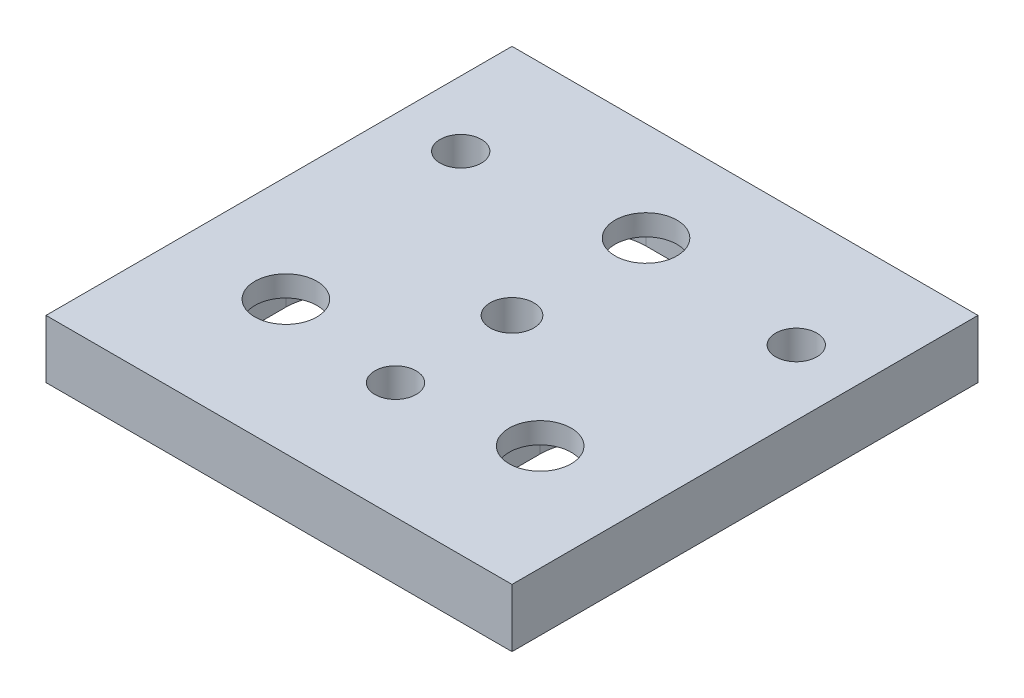
ISO-10303-21;
HEADER;
FILE_DESCRIPTION(('STEP AP214'),'2;1');
FILE_NAME('part.step','',(''),(''),'','','');
FILE_SCHEMA(('AUTOMOTIVE_DESIGN { 1 0 10303 214 1 1 1 1 }'));
ENDSEC;
DATA;
#1=APPLICATION_CONTEXT('core data for automotive mechanical design processes');
#2=APPLICATION_PROTOCOL_DEFINITION('international standard','automotive_design',2000,#1);
#3=PRODUCT_CONTEXT('',#1,'mechanical');
#4=PRODUCT('Part','Part','',(#3));
#5=PRODUCT_RELATED_PRODUCT_CATEGORY('part','',(#4));
#6=PRODUCT_DEFINITION_FORMATION('','',#4);
#7=PRODUCT_DEFINITION_CONTEXT('part definition',#1,'design');
#8=PRODUCT_DEFINITION('design','',#6,#7);
#9=PRODUCT_DEFINITION_SHAPE('','',#8);
#10=(LENGTH_UNIT() NAMED_UNIT(*) SI_UNIT(.MILLI.,.METRE.));
#11=(NAMED_UNIT(*) PLANE_ANGLE_UNIT() SI_UNIT($,.RADIAN.));
#12=(NAMED_UNIT(*) SI_UNIT($,.STERADIAN.) SOLID_ANGLE_UNIT());
#13=UNCERTAINTY_MEASURE_WITH_UNIT(LENGTH_MEASURE(1.E-05),#10,'distance_accuracy_value','');
#14=(GEOMETRIC_REPRESENTATION_CONTEXT(3) GLOBAL_UNCERTAINTY_ASSIGNED_CONTEXT((#13)) GLOBAL_UNIT_ASSIGNED_CONTEXT((#10,
#11,#12)) REPRESENTATION_CONTEXT('',''));
#15=CARTESIAN_POINT('',(0.,0.,0.));
#16=DIRECTION('',(0.,0.,1.));
#17=DIRECTION('',(1.,0.,0.));
#18=AXIS2_PLACEMENT_3D('',#15,#16,#17);
#19=CARTESIAN_POINT('',(0.,6.35,-14.61008));
#20=DIRECTION('',(0.,1.,0.));
#21=DIRECTION('',(0.,0.,1.));
#22=AXIS2_PLACEMENT_3D('',#19,#20,#21);
#23=CYLINDRICAL_SURFACE('',#22,3.3782);
#24=CARTESIAN_POINT('',(0.,6.35,-14.61008));
#25=DIRECTION('',(0.,1.,0.));
#26=DIRECTION('',(0.,0.,1.));
#27=AXIS2_PLACEMENT_3D('',#24,#25,#26);
#28=CIRCLE('',#27,3.3782);
#29=CARTESIAN_POINT('',(0.,6.35,-11.23188));
#30=VERTEX_POINT('',#29);
#31=EDGE_CURVE('E256',#30,#30,#28,.T.);
#32=ORIENTED_EDGE('',*,*,#31,.T.);
#33=EDGE_LOOP('',(#32));
#34=FACE_BOUND('',#33,.T.);
#35=CARTESIAN_POINT('',(0.,4.064,-14.61008));
#36=DIRECTION('',(0.,-1.,0.));
#37=DIRECTION('',(0.,0.,-1.));
#38=AXIS2_PLACEMENT_3D('',#35,#36,#37);
#39=CIRCLE('',#38,3.3782);
#40=CARTESIAN_POINT('',(0.,4.064,-17.98828));
#41=VERTEX_POINT('',#40);
#42=EDGE_CURVE('E38',#41,#41,#39,.F.);
#43=ORIENTED_EDGE('',*,*,#42,.F.);
#44=EDGE_LOOP('',(#43));
#45=FACE_BOUND('',#44,.T.);
#46=ADVANCED_FACE('F34',(#34,#45),#23,.F.);
#47=CARTESIAN_POINT('',(-25.4,6.35,-25.4));
#48=DIRECTION('',(1.,0.,0.));
#49=DIRECTION('',(0.,0.,-1.));
#50=AXIS2_PLACEMENT_3D('',#47,#48,#49);
#51=PLANE('',#50);
#52=DIRECTION('',(0.,0.,1.));
#53=VECTOR('',#52,1.);
#54=CARTESIAN_POINT('',(-25.4,0.,-25.4));
#55=LINE('',#54,#53);
#56=CARTESIAN_POINT('',(-25.4,0.,-25.4));
#57=VERTEX_POINT('',#56);
#58=CARTESIAN_POINT('',(-25.4,0.,25.4));
#59=VERTEX_POINT('',#58);
#60=EDGE_CURVE('E283',#57,#59,#55,.T.);
#61=ORIENTED_EDGE('',*,*,#60,.T.);
#62=DIRECTION('',(0.,-1.,0.));
#63=VECTOR('',#62,1.);
#64=CARTESIAN_POINT('',(-25.4,6.35,25.4));
#65=LINE('',#64,#63);
#66=CARTESIAN_POINT('',(-25.4,6.35,25.4));
#67=VERTEX_POINT('',#66);
#68=EDGE_CURVE('E11',#67,#59,#65,.T.);
#69=ORIENTED_EDGE('',*,*,#68,.F.);
#70=DIRECTION('',(0.,0.,1.));
#71=VECTOR('',#70,1.);
#72=CARTESIAN_POINT('',(-25.4,6.35,-25.4));
#73=LINE('',#72,#71);
#74=CARTESIAN_POINT('',(-25.4,6.35,-25.4));
#75=VERTEX_POINT('',#74);
#76=EDGE_CURVE('E284',#75,#67,#73,.T.);
#77=ORIENTED_EDGE('',*,*,#76,.F.);
#78=DIRECTION('',(0.,-1.,0.));
#79=VECTOR('',#78,1.);
#80=CARTESIAN_POINT('',(-25.4,6.35,-25.4));
#81=LINE('',#80,#79);
#82=EDGE_CURVE('E294',#75,#57,#81,.T.);
#83=ORIENTED_EDGE('',*,*,#82,.T.);
#84=EDGE_LOOP('',(#61,#69,#77,#83));
#85=FACE_BOUND('',#84,.T.);
#86=ADVANCED_FACE('F36',(#85),#51,.F.);
#87=CARTESIAN_POINT('',(-25.4,6.35,25.4));
#88=DIRECTION('',(0.,0.,-1.));
#89=DIRECTION('',(-1.,0.,0.));
#90=AXIS2_PLACEMENT_3D('',#87,#88,#89);
#91=PLANE('',#90);
#92=DIRECTION('',(1.,0.,0.));
#93=VECTOR('',#92,1.);
#94=CARTESIAN_POINT('',(-25.4,0.,25.4));
#95=LINE('',#94,#93);
#96=CARTESIAN_POINT('',(25.4,0.,25.4));
#97=VERTEX_POINT('',#96);
#98=EDGE_CURVE('E297',#59,#97,#95,.T.);
#99=ORIENTED_EDGE('',*,*,#98,.T.);
#100=DIRECTION('',(0.,-1.,0.));
#101=VECTOR('',#100,1.);
#102=CARTESIAN_POINT('',(25.4,6.35,25.4));
#103=LINE('',#102,#101);
#104=CARTESIAN_POINT('',(25.4,6.35,25.4));
#105=VERTEX_POINT('',#104);
#106=EDGE_CURVE('E43',#105,#97,#103,.T.);
#107=ORIENTED_EDGE('',*,*,#106,.F.);
#108=DIRECTION('',(1.,0.,0.));
#109=VECTOR('',#108,1.);
#110=CARTESIAN_POINT('',(-25.4,6.35,25.4));
#111=LINE('',#110,#109);
#112=EDGE_CURVE('E287',#67,#105,#111,.T.);
#113=ORIENTED_EDGE('',*,*,#112,.F.);
#114=ORIENTED_EDGE('',*,*,#68,.T.);
#115=EDGE_LOOP('',(#99,#107,#113,#114));
#116=FACE_BOUND('',#115,.T.);
#117=ADVANCED_FACE('F339',(#116),#91,.F.);
#118=CARTESIAN_POINT('',(25.4,6.35,-25.4));
#119=DIRECTION('',(-1.,0.,0.));
#120=DIRECTION('',(0.,0.,1.));
#121=AXIS2_PLACEMENT_3D('',#118,#119,#120);
#122=PLANE('',#121);
#123=DIRECTION('',(0.,0.,-1.));
#124=VECTOR('',#123,1.);
#125=CARTESIAN_POINT('',(25.4,0.,-25.4));
#126=LINE('',#125,#124);
#127=CARTESIAN_POINT('',(25.4,0.,-25.4));
#128=VERTEX_POINT('',#127);
#129=EDGE_CURVE('E299',#97,#128,#126,.T.);
#130=ORIENTED_EDGE('',*,*,#129,.T.);
#131=DIRECTION('',(0.,-1.,0.));
#132=VECTOR('',#131,1.);
#133=CARTESIAN_POINT('',(25.4,6.35,-25.4));
#134=LINE('',#133,#132);
#135=CARTESIAN_POINT('',(25.4,6.35,-25.4));
#136=VERTEX_POINT('',#135);
#137=EDGE_CURVE('E304',#136,#128,#134,.T.);
#138=ORIENTED_EDGE('',*,*,#137,.F.);
#139=DIRECTION('',(0.,0.,-1.));
#140=VECTOR('',#139,1.);
#141=CARTESIAN_POINT('',(25.4,6.35,-25.4));
#142=LINE('',#141,#140);
#143=EDGE_CURVE('E290',#105,#136,#142,.T.);
#144=ORIENTED_EDGE('',*,*,#143,.F.);
#145=ORIENTED_EDGE('',*,*,#106,.T.);
#146=EDGE_LOOP('',(#130,#138,#144,#145));
#147=FACE_BOUND('',#146,.T.);
#148=ADVANCED_FACE('F375',(#147),#122,.F.);
#149=CARTESIAN_POINT('',(-25.4,6.35,-25.4));
#150=DIRECTION('',(0.,0.,1.));
#151=DIRECTION('',(1.,0.,0.));
#152=AXIS2_PLACEMENT_3D('',#149,#150,#151);
#153=PLANE('',#152);
#154=DIRECTION('',(-1.,0.,0.));
#155=VECTOR('',#154,1.);
#156=CARTESIAN_POINT('',(-25.4,0.,-25.4));
#157=LINE('',#156,#155);
#158=EDGE_CURVE('E288',#128,#57,#157,.T.);
#159=ORIENTED_EDGE('',*,*,#158,.T.);
#160=ORIENTED_EDGE('',*,*,#82,.F.);
#161=DIRECTION('',(-1.,0.,0.));
#162=VECTOR('',#161,1.);
#163=CARTESIAN_POINT('',(-25.4,6.35,-25.4));
#164=LINE('',#163,#162);
#165=EDGE_CURVE('E292',#136,#75,#164,.T.);
#166=ORIENTED_EDGE('',*,*,#165,.F.);
#167=ORIENTED_EDGE('',*,*,#137,.T.);
#168=EDGE_LOOP('',(#159,#160,#166,#167));
#169=FACE_BOUND('',#168,.T.);
#170=ADVANCED_FACE('F368',(#169),#153,.F.);
#171=CARTESIAN_POINT('',(0.,6.35,0.));
#172=DIRECTION('',(0.,1.,0.));
#173=DIRECTION('',(0.,0.,1.));
#174=AXIS2_PLACEMENT_3D('',#171,#172,#173);
#175=PLANE('',#174);
#176=CARTESIAN_POINT('',(0.,6.35,0.));
#177=DIRECTION('',(0.,1.,0.));
#178=DIRECTION('',(0.,0.,1.));
#179=AXIS2_PLACEMENT_3D('',#176,#177,#178);
#180=CIRCLE('',#179,2.38125);
#181=CARTESIAN_POINT('',(0.,6.35,2.38125));
#182=VERTEX_POINT('',#181);
#183=EDGE_CURVE('E176',#182,#182,#180,.T.);
#184=ORIENTED_EDGE('',*,*,#183,.F.);
#185=EDGE_LOOP('',(#184));
#186=FACE_BOUND('',#185,.T.);
#187=ORIENTED_EDGE('',*,*,#31,.F.);
#188=EDGE_LOOP('',(#187));
#189=FACE_BOUND('',#188,.T.);
#190=CARTESIAN_POINT('',(-13.86078,6.35,10.78992));
#191=DIRECTION('',(0.,1.,0.));
#192=DIRECTION('',(0.,0.,1.));
#193=AXIS2_PLACEMENT_3D('',#190,#191,#192);
#194=CIRCLE('',#193,3.3782);
#195=CARTESIAN_POINT('',(-13.86078,6.35,14.16812));
#196=VERTEX_POINT('',#195);
#197=EDGE_CURVE('E259',#196,#196,#194,.T.);
#198=ORIENTED_EDGE('',*,*,#197,.F.);
#199=EDGE_LOOP('',(#198));
#200=FACE_BOUND('',#199,.T.);
#201=CARTESIAN_POINT('',(13.86078,6.35,10.78992));
#202=DIRECTION('',(0.,1.,0.));
#203=DIRECTION('',(0.,0.,1.));
#204=AXIS2_PLACEMENT_3D('',#201,#202,#203);
#205=CIRCLE('',#204,3.3782);
#206=CARTESIAN_POINT('',(13.86078,6.35,14.16812));
#207=VERTEX_POINT('',#206);
#208=EDGE_CURVE('E262',#207,#207,#205,.T.);
#209=ORIENTED_EDGE('',*,*,#208,.F.);
#210=EDGE_LOOP('',(#209));
#211=FACE_BOUND('',#210,.T.);
#212=CARTESIAN_POINT('',(-18.288,6.35,-12.7));
#213=DIRECTION('',(0.,1.,0.));
#214=DIRECTION('',(0.,0.,1.));
#215=AXIS2_PLACEMENT_3D('',#212,#213,#214);
#216=CIRCLE('',#215,2.24789999999999);
#217=CARTESIAN_POINT('',(-18.288,6.35,-10.4521));
#218=VERTEX_POINT('',#217);
#219=EDGE_CURVE('E265',#218,#218,#216,.T.);
#220=ORIENTED_EDGE('',*,*,#219,.F.);
#221=EDGE_LOOP('',(#220));
#222=FACE_BOUND('',#221,.T.);
#223=CARTESIAN_POINT('',(18.288,6.35,-12.7));
#224=DIRECTION('',(0.,1.,0.));
#225=DIRECTION('',(0.,0.,1.));
#226=AXIS2_PLACEMENT_3D('',#223,#224,#225);
#227=CIRCLE('',#226,2.24789999999999);
#228=CARTESIAN_POINT('',(18.288,6.35,-10.4521));
#229=VERTEX_POINT('',#228);
#230=EDGE_CURVE('E271',#229,#229,#227,.T.);
#231=ORIENTED_EDGE('',*,*,#230,.F.);
#232=EDGE_LOOP('',(#231));
#233=FACE_BOUND('',#232,.T.);
#234=CARTESIAN_POINT('',(0.,6.35,12.7));
#235=DIRECTION('',(0.,1.,0.));
#236=DIRECTION('',(0.,0.,1.));
#237=AXIS2_PLACEMENT_3D('',#234,#235,#236);
#238=CIRCLE('',#237,2.24789999999999);
#239=CARTESIAN_POINT('',(0.,6.35,14.9479));
#240=VERTEX_POINT('',#239);
#241=EDGE_CURVE('E277',#240,#240,#238,.T.);
#242=ORIENTED_EDGE('',*,*,#241,.F.);
#243=EDGE_LOOP('',(#242));
#244=FACE_BOUND('',#243,.T.);
#245=ORIENTED_EDGE('',*,*,#76,.T.);
#246=ORIENTED_EDGE('',*,*,#112,.T.);
#247=ORIENTED_EDGE('',*,*,#143,.T.);
#248=ORIENTED_EDGE('',*,*,#165,.T.);
#249=EDGE_LOOP('',(#245,#246,#247,#248));
#250=FACE_BOUND('',#249,.T.);
#251=ADVANCED_FACE('F365',(#186,#189,#200,#211,#222,#233,#244,#250),#175,.T.);
#252=CARTESIAN_POINT('',(0.,0.,0.));
#253=DIRECTION('',(0.,1.,0.));
#254=DIRECTION('',(0.,0.,1.));
#255=AXIS2_PLACEMENT_3D('',#252,#253,#254);
#256=PLANE('',#255);
#257=CARTESIAN_POINT('',(0.,0.,0.));
#258=DIRECTION('',(0.,1.,0.));
#259=DIRECTION('',(0.,0.,1.));
#260=AXIS2_PLACEMENT_3D('',#257,#258,#259);
#261=CIRCLE('',#260,2.38125);
#262=CARTESIAN_POINT('',(0.,0.,2.38125));
#263=VERTEX_POINT('',#262);
#264=EDGE_CURVE('E183',#263,#263,#261,.T.);
#265=ORIENTED_EDGE('',*,*,#264,.T.);
#266=EDGE_LOOP('',(#265));
#267=FACE_BOUND('',#266,.T.);
#268=DIRECTION('',(1.,0.,0.));
#269=VECTOR('',#268,1.);
#270=CARTESIAN_POINT('',(-5.588,0.,-20.19808));
#271=LINE('',#270,#269);
#272=CARTESIAN_POINT('',(-5.588,0.,-20.19808));
#273=VERTEX_POINT('',#272);
#274=CARTESIAN_POINT('',(5.588,0.,-20.19808));
#275=VERTEX_POINT('',#274);
#276=EDGE_CURVE('E182',#273,#275,#271,.T.);
#277=ORIENTED_EDGE('',*,*,#276,.F.);
#278=CARTESIAN_POINT('',(-5.588,0.,-14.61008));
#279=DIRECTION('',(0.,-1.,0.));
#280=DIRECTION('',(0.,0.,-1.));
#281=AXIS2_PLACEMENT_3D('',#278,#279,#280);
#282=CIRCLE('',#281,5.588);
#283=CARTESIAN_POINT('',(-5.588,0.,-9.02208));
#284=VERTEX_POINT('',#283);
#285=EDGE_CURVE('E51',#284,#273,#282,.T.);
#286=ORIENTED_EDGE('',*,*,#285,.F.);
#287=DIRECTION('',(-1.,0.,0.));
#288=VECTOR('',#287,1.);
#289=CARTESIAN_POINT('',(-5.588,0.,-9.02208));
#290=LINE('',#289,#288);
#291=CARTESIAN_POINT('',(5.588,0.,-9.02208));
#292=VERTEX_POINT('',#291);
#293=EDGE_CURVE('E170',#292,#284,#290,.T.);
#294=ORIENTED_EDGE('',*,*,#293,.F.);
#295=CARTESIAN_POINT('',(5.588,0.,-14.61008));
#296=DIRECTION('',(0.,-1.,0.));
#297=DIRECTION('',(0.,0.,1.));
#298=AXIS2_PLACEMENT_3D('',#295,#296,#297);
#299=CIRCLE('',#298,5.588);
#300=EDGE_CURVE('E173',#275,#292,#299,.T.);
#301=ORIENTED_EDGE('',*,*,#300,.F.);
#302=EDGE_LOOP('',(#277,#286,#294,#301));
#303=FACE_BOUND('',#302,.T.);
#304=DIRECTION('',(0.,0.,-1.));
#305=VECTOR('',#304,1.);
#306=CARTESIAN_POINT('',(8.27278,0.,16.37792));
#307=LINE('',#306,#305);
#308=CARTESIAN_POINT('',(8.27278,0.,16.37792));
#309=VERTEX_POINT('',#308);
#310=CARTESIAN_POINT('',(8.27278,0.,5.20192));
#311=VERTEX_POINT('',#310);
#312=EDGE_CURVE('E207',#309,#311,#307,.T.);
#313=ORIENTED_EDGE('',*,*,#312,.F.);
#314=CARTESIAN_POINT('',(13.86078,0.,16.37792));
#315=DIRECTION('',(0.,-1.,0.));
#316=DIRECTION('',(0.,0.,1.));
#317=AXIS2_PLACEMENT_3D('',#314,#315,#316);
#318=CIRCLE('',#317,5.588);
#319=CARTESIAN_POINT('',(19.44878,0.,16.37792));
#320=VERTEX_POINT('',#319);
#321=EDGE_CURVE('E59',#320,#309,#318,.T.);
#322=ORIENTED_EDGE('',*,*,#321,.F.);
#323=DIRECTION('',(0.,0.,1.));
#324=VECTOR('',#323,1.);
#325=CARTESIAN_POINT('',(19.44878,0.,16.37792));
#326=LINE('',#325,#324);
#327=CARTESIAN_POINT('',(19.44878,0.,5.20192));
#328=VERTEX_POINT('',#327);
#329=EDGE_CURVE('E196',#328,#320,#326,.T.);
#330=ORIENTED_EDGE('',*,*,#329,.F.);
#331=CARTESIAN_POINT('',(13.86078,0.,5.20192));
#332=DIRECTION('',(0.,-1.,0.));
#333=DIRECTION('',(0.,0.,1.));
#334=AXIS2_PLACEMENT_3D('',#331,#332,#333);
#335=CIRCLE('',#334,5.588);
#336=EDGE_CURVE('E210',#311,#328,#335,.T.);
#337=ORIENTED_EDGE('',*,*,#336,.F.);
#338=EDGE_LOOP('',(#313,#322,#330,#337));
#339=FACE_BOUND('',#338,.T.);
#340=DIRECTION('',(0.,0.,-1.));
#341=VECTOR('',#340,1.);
#342=CARTESIAN_POINT('',(-19.44878,0.,16.37792));
#343=LINE('',#342,#341);
#344=CARTESIAN_POINT('',(-19.44878,0.,16.37792));
#345=VERTEX_POINT('',#344);
#346=CARTESIAN_POINT('',(-19.44878,0.,5.20192));
#347=VERTEX_POINT('',#346);
#348=EDGE_CURVE('E239',#345,#347,#343,.T.);
#349=ORIENTED_EDGE('',*,*,#348,.F.);
#350=CARTESIAN_POINT('',(-13.86078,0.,16.37792));
#351=DIRECTION('',(0.,-1.,0.));
#352=DIRECTION('',(0.,0.,1.));
#353=AXIS2_PLACEMENT_3D('',#350,#351,#352);
#354=CIRCLE('',#353,5.588);
#355=CARTESIAN_POINT('',(-8.27278,0.,16.37792));
#356=VERTEX_POINT('',#355);
#357=EDGE_CURVE('E237',#356,#345,#354,.T.);
#358=ORIENTED_EDGE('',*,*,#357,.F.);
#359=DIRECTION('',(0.,0.,1.));
#360=VECTOR('',#359,1.);
#361=CARTESIAN_POINT('',(-8.27278,0.,16.37792));
#362=LINE('',#361,#360);
#363=CARTESIAN_POINT('',(-8.27277999999999,0.,5.20192));
#364=VERTEX_POINT('',#363);
#365=EDGE_CURVE('E227',#364,#356,#362,.T.);
#366=ORIENTED_EDGE('',*,*,#365,.F.);
#367=CARTESIAN_POINT('',(-13.86078,0.,5.20192));
#368=DIRECTION('',(0.,-1.,0.));
#369=DIRECTION('',(0.,0.,-1.));
#370=AXIS2_PLACEMENT_3D('',#367,#368,#369);
#371=CIRCLE('',#370,5.588);
#372=EDGE_CURVE('E242',#347,#364,#371,.T.);
#373=ORIENTED_EDGE('',*,*,#372,.F.);
#374=EDGE_LOOP('',(#349,#358,#366,#373));
#375=FACE_BOUND('',#374,.T.);
#376=CARTESIAN_POINT('',(-18.288,0.,-12.7));
#377=DIRECTION('',(0.,1.,0.));
#378=DIRECTION('',(0.,0.,1.));
#379=AXIS2_PLACEMENT_3D('',#376,#377,#378);
#380=CIRCLE('',#379,2.2479);
#381=CARTESIAN_POINT('',(-18.288,0.,-10.4521));
#382=VERTEX_POINT('',#381);
#383=EDGE_CURVE('E268',#382,#382,#380,.T.);
#384=ORIENTED_EDGE('',*,*,#383,.T.);
#385=EDGE_LOOP('',(#384));
#386=FACE_BOUND('',#385,.T.);
#387=CARTESIAN_POINT('',(18.288,0.,-12.7));
#388=DIRECTION('',(0.,1.,0.));
#389=DIRECTION('',(0.,0.,1.));
#390=AXIS2_PLACEMENT_3D('',#387,#388,#389);
#391=CIRCLE('',#390,2.2479);
#392=CARTESIAN_POINT('',(18.288,0.,-10.4521));
#393=VERTEX_POINT('',#392);
#394=EDGE_CURVE('E274',#393,#393,#391,.T.);
#395=ORIENTED_EDGE('',*,*,#394,.T.);
#396=EDGE_LOOP('',(#395));
#397=FACE_BOUND('',#396,.T.);
#398=CARTESIAN_POINT('',(0.,0.,12.7));
#399=DIRECTION('',(0.,1.,0.));
#400=DIRECTION('',(0.,0.,1.));
#401=AXIS2_PLACEMENT_3D('',#398,#399,#400);
#402=CIRCLE('',#401,2.2479);
#403=CARTESIAN_POINT('',(0.,0.,14.9479));
#404=VERTEX_POINT('',#403);
#405=EDGE_CURVE('E280',#404,#404,#402,.T.);
#406=ORIENTED_EDGE('',*,*,#405,.T.);
#407=EDGE_LOOP('',(#406));
#408=FACE_BOUND('',#407,.T.);
#409=ORIENTED_EDGE('',*,*,#60,.F.);
#410=ORIENTED_EDGE('',*,*,#158,.F.);
#411=ORIENTED_EDGE('',*,*,#129,.F.);
#412=ORIENTED_EDGE('',*,*,#98,.F.);
#413=EDGE_LOOP('',(#409,#410,#411,#412));
#414=FACE_BOUND('',#413,.T.);
#415=ADVANCED_FACE('F363',(#267,#303,#339,#375,#386,#397,#408,#414),#256,.F.);
#416=CARTESIAN_POINT('',(0.,6.35,12.7));
#417=DIRECTION('',(0.,1.,0.));
#418=DIRECTION('',(0.,0.,1.));
#419=AXIS2_PLACEMENT_3D('',#416,#417,#418);
#420=CYLINDRICAL_SURFACE('',#419,2.24789999999999);
#421=ORIENTED_EDGE('',*,*,#405,.F.);
#422=EDGE_LOOP('',(#421));
#423=FACE_BOUND('',#422,.T.);
#424=ORIENTED_EDGE('',*,*,#241,.T.);
#425=EDGE_LOOP('',(#424));
#426=FACE_BOUND('',#425,.T.);
#427=ADVANCED_FACE('F359',(#423,#426),#420,.F.);
#428=CARTESIAN_POINT('',(18.288,6.35,-12.7));
#429=DIRECTION('',(0.,1.,0.));
#430=DIRECTION('',(0.,0.,1.));
#431=AXIS2_PLACEMENT_3D('',#428,#429,#430);
#432=CYLINDRICAL_SURFACE('',#431,2.24789999999999);
#433=ORIENTED_EDGE('',*,*,#394,.F.);
#434=EDGE_LOOP('',(#433));
#435=FACE_BOUND('',#434,.T.);
#436=ORIENTED_EDGE('',*,*,#230,.T.);
#437=EDGE_LOOP('',(#436));
#438=FACE_BOUND('',#437,.T.);
#439=ADVANCED_FACE('F355',(#435,#438),#432,.F.);
#440=CARTESIAN_POINT('',(-18.288,6.35,-12.7));
#441=DIRECTION('',(0.,1.,0.));
#442=DIRECTION('',(0.,0.,1.));
#443=AXIS2_PLACEMENT_3D('',#440,#441,#442);
#444=CYLINDRICAL_SURFACE('',#443,2.24789999999999);
#445=ORIENTED_EDGE('',*,*,#383,.F.);
#446=EDGE_LOOP('',(#445));
#447=FACE_BOUND('',#446,.T.);
#448=ORIENTED_EDGE('',*,*,#219,.T.);
#449=EDGE_LOOP('',(#448));
#450=FACE_BOUND('',#449,.T.);
#451=ADVANCED_FACE('F352',(#447,#450),#444,.F.);
#452=CARTESIAN_POINT('',(13.86078,6.35,10.78992));
#453=DIRECTION('',(0.,1.,0.));
#454=DIRECTION('',(0.,0.,1.));
#455=AXIS2_PLACEMENT_3D('',#452,#453,#454);
#456=CYLINDRICAL_SURFACE('',#455,3.3782);
#457=CARTESIAN_POINT('',(13.86078,4.064,10.78992));
#458=DIRECTION('',(0.,1.,0.));
#459=DIRECTION('',(0.,0.,1.));
#460=AXIS2_PLACEMENT_3D('',#457,#458,#459);
#461=CIRCLE('',#460,3.3782);
#462=CARTESIAN_POINT('',(13.86078,4.064,14.16812));
#463=VERTEX_POINT('',#462);
#464=EDGE_CURVE('E217',#463,#463,#461,.F.);
#465=ORIENTED_EDGE('',*,*,#464,.T.);
#466=EDGE_LOOP('',(#465));
#467=FACE_BOUND('',#466,.T.);
#468=ORIENTED_EDGE('',*,*,#208,.T.);
#469=EDGE_LOOP('',(#468));
#470=FACE_BOUND('',#469,.T.);
#471=ADVANCED_FACE('F313',(#467,#470),#456,.F.);
#472=CARTESIAN_POINT('',(-13.86078,6.35,10.78992));
#473=DIRECTION('',(0.,1.,0.));
#474=DIRECTION('',(0.,0.,1.));
#475=AXIS2_PLACEMENT_3D('',#472,#473,#474);
#476=CYLINDRICAL_SURFACE('',#475,3.3782);
#477=CARTESIAN_POINT('',(-13.86078,4.064,10.78992));
#478=DIRECTION('',(0.,1.,0.));
#479=DIRECTION('',(0.,0.,1.));
#480=AXIS2_PLACEMENT_3D('',#477,#478,#479);
#481=CIRCLE('',#480,3.3782);
#482=CARTESIAN_POINT('',(-13.86078,4.064,14.16812));
#483=VERTEX_POINT('',#482);
#484=EDGE_CURVE('E249',#483,#483,#481,.F.);
#485=ORIENTED_EDGE('',*,*,#484,.T.);
#486=EDGE_LOOP('',(#485));
#487=FACE_BOUND('',#486,.T.);
#488=ORIENTED_EDGE('',*,*,#197,.T.);
#489=EDGE_LOOP('',(#488));
#490=FACE_BOUND('',#489,.T.);
#491=ADVANCED_FACE('F345',(#487,#490),#476,.F.);
#492=CARTESIAN_POINT('',(-13.86078,4.064,16.37792));
#493=DIRECTION('',(0.,1.,0.));
#494=DIRECTION('',(0.,0.,1.));
#495=AXIS2_PLACEMENT_3D('',#492,#493,#494);
#496=PLANE('',#495);
#497=CARTESIAN_POINT('',(-13.86078,4.064,16.37792));
#498=DIRECTION('',(0.,-1.,0.));
#499=DIRECTION('',(0.,0.,1.));
#500=AXIS2_PLACEMENT_3D('',#497,#498,#499);
#501=CIRCLE('',#500,5.588);
#502=CARTESIAN_POINT('',(-8.27278,4.064,16.37792));
#503=VERTEX_POINT('',#502);
#504=CARTESIAN_POINT('',(-19.44878,4.064,16.37792));
#505=VERTEX_POINT('',#504);
#506=EDGE_CURVE('E223',#503,#505,#501,.T.);
#507=ORIENTED_EDGE('',*,*,#506,.T.);
#508=DIRECTION('',(0.,0.,-1.));
#509=VECTOR('',#508,1.);
#510=CARTESIAN_POINT('',(-19.44878,4.064,16.37792));
#511=LINE('',#510,#509);
#512=CARTESIAN_POINT('',(-19.44878,4.064,5.20192));
#513=VERTEX_POINT('',#512);
#514=EDGE_CURVE('E226',#505,#513,#511,.T.);
#515=ORIENTED_EDGE('',*,*,#514,.T.);
#516=CARTESIAN_POINT('',(-13.86078,4.064,5.20192));
#517=DIRECTION('',(0.,-1.,0.));
#518=DIRECTION('',(0.,0.,-1.));
#519=AXIS2_PLACEMENT_3D('',#516,#517,#518);
#520=CIRCLE('',#519,5.588);
#521=CARTESIAN_POINT('',(-8.27277999999999,4.064,5.20192));
#522=VERTEX_POINT('',#521);
#523=EDGE_CURVE('E230',#513,#522,#520,.T.);
#524=ORIENTED_EDGE('',*,*,#523,.T.);
#525=DIRECTION('',(0.,0.,1.));
#526=VECTOR('',#525,1.);
#527=CARTESIAN_POINT('',(-8.27278,4.064,16.37792));
#528=LINE('',#527,#526);
#529=EDGE_CURVE('E233',#522,#503,#528,.T.);
#530=ORIENTED_EDGE('',*,*,#529,.T.);
#531=EDGE_LOOP('',(#507,#515,#524,#530));
#532=FACE_BOUND('',#531,.T.);
#533=ORIENTED_EDGE('',*,*,#484,.F.);
#534=EDGE_LOOP('',(#533));
#535=FACE_BOUND('',#534,.T.);
#536=ADVANCED_FACE('F348',(#532,#535),#496,.F.);
#537=CARTESIAN_POINT('',(-13.86078,4.064,16.37792));
#538=DIRECTION('',(0.,-1.,0.));
#539=DIRECTION('',(0.,0.,-1.));
#540=AXIS2_PLACEMENT_3D('',#537,#538,#539);
#541=CYLINDRICAL_SURFACE('',#540,5.588);
#542=ORIENTED_EDGE('',*,*,#357,.T.);
#543=DIRECTION('',(0.,-1.,0.));
#544=VECTOR('',#543,1.);
#545=CARTESIAN_POINT('',(-19.44878,4.064,16.37792));
#546=LINE('',#545,#544);
#547=EDGE_CURVE('E236',#505,#345,#546,.T.);
#548=ORIENTED_EDGE('',*,*,#547,.F.);
#549=ORIENTED_EDGE('',*,*,#506,.F.);
#550=DIRECTION('',(0.,-1.,0.));
#551=VECTOR('',#550,1.);
#552=CARTESIAN_POINT('',(-8.27278,4.064,16.37792));
#553=LINE('',#552,#551);
#554=EDGE_CURVE('E247',#503,#356,#553,.T.);
#555=ORIENTED_EDGE('',*,*,#554,.T.);
#556=EDGE_LOOP('',(#542,#548,#549,#555));
#557=FACE_BOUND('',#556,.T.);
#558=ADVANCED_FACE('F344',(#557),#541,.F.);
#559=CARTESIAN_POINT('',(-8.27278,4.064,16.37792));
#560=DIRECTION('',(1.,0.,0.));
#561=DIRECTION('',(0.,0.,-1.));
#562=AXIS2_PLACEMENT_3D('',#559,#560,#561);
#563=PLANE('',#562);
#564=ORIENTED_EDGE('',*,*,#365,.T.);
#565=ORIENTED_EDGE('',*,*,#554,.F.);
#566=ORIENTED_EDGE('',*,*,#529,.F.);
#567=DIRECTION('',(0.,-1.,0.));
#568=VECTOR('',#567,1.);
#569=CARTESIAN_POINT('',(-8.27277999999999,4.064,5.20192));
#570=LINE('',#569,#568);
#571=EDGE_CURVE('E250',#522,#364,#570,.T.);
#572=ORIENTED_EDGE('',*,*,#571,.T.);
#573=EDGE_LOOP('',(#564,#565,#566,#572));
#574=FACE_BOUND('',#573,.T.);
#575=ADVANCED_FACE('F448',(#574),#563,.F.);
#576=CARTESIAN_POINT('',(-13.86078,4.064,5.20192));
#577=DIRECTION('',(0.,-1.,0.));
#578=DIRECTION('',(0.,0.,-1.));
#579=AXIS2_PLACEMENT_3D('',#576,#577,#578);
#580=CYLINDRICAL_SURFACE('',#579,5.588);
#581=ORIENTED_EDGE('',*,*,#372,.T.);
#582=ORIENTED_EDGE('',*,*,#571,.F.);
#583=ORIENTED_EDGE('',*,*,#523,.F.);
#584=DIRECTION('',(0.,-1.,0.));
#585=VECTOR('',#584,1.);
#586=CARTESIAN_POINT('',(-19.44878,4.064,5.20192));
#587=LINE('',#586,#585);
#588=EDGE_CURVE('E252',#513,#347,#587,.T.);
#589=ORIENTED_EDGE('',*,*,#588,.T.);
#590=EDGE_LOOP('',(#581,#582,#583,#589));
#591=FACE_BOUND('',#590,.T.);
#592=ADVANCED_FACE('F328',(#591),#580,.F.);
#593=CARTESIAN_POINT('',(-19.44878,4.064,16.37792));
#594=DIRECTION('',(-1.,0.,0.));
#595=DIRECTION('',(0.,0.,1.));
#596=AXIS2_PLACEMENT_3D('',#593,#594,#595);
#597=PLANE('',#596);
#598=ORIENTED_EDGE('',*,*,#348,.T.);
#599=ORIENTED_EDGE('',*,*,#588,.F.);
#600=ORIENTED_EDGE('',*,*,#514,.F.);
#601=ORIENTED_EDGE('',*,*,#547,.T.);
#602=EDGE_LOOP('',(#598,#599,#600,#601));
#603=FACE_BOUND('',#602,.T.);
#604=ADVANCED_FACE('F319',(#603),#597,.F.);
#605=CARTESIAN_POINT('',(13.86078,4.064,16.37792));
#606=DIRECTION('',(0.,1.,0.));
#607=DIRECTION('',(0.,0.,1.));
#608=AXIS2_PLACEMENT_3D('',#605,#606,#607);
#609=PLANE('',#608);
#610=CARTESIAN_POINT('',(13.86078,4.064,16.37792));
#611=DIRECTION('',(0.,-1.,0.));
#612=DIRECTION('',(0.,0.,1.));
#613=AXIS2_PLACEMENT_3D('',#610,#611,#612);
#614=CIRCLE('',#613,5.588);
#615=CARTESIAN_POINT('',(19.44878,4.064,16.37792));
#616=VERTEX_POINT('',#615);
#617=CARTESIAN_POINT('',(8.27278,4.064,16.37792));
#618=VERTEX_POINT('',#617);
#619=EDGE_CURVE('E192',#616,#618,#614,.T.);
#620=ORIENTED_EDGE('',*,*,#619,.T.);
#621=DIRECTION('',(0.,0.,-1.));
#622=VECTOR('',#621,1.);
#623=CARTESIAN_POINT('',(8.27278,4.064,16.37792));
#624=LINE('',#623,#622);
#625=CARTESIAN_POINT('',(8.27278,4.064,5.20192));
#626=VERTEX_POINT('',#625);
#627=EDGE_CURVE('E195',#618,#626,#624,.T.);
#628=ORIENTED_EDGE('',*,*,#627,.T.);
#629=CARTESIAN_POINT('',(13.86078,4.064,5.20192));
#630=DIRECTION('',(0.,-1.,0.));
#631=DIRECTION('',(0.,0.,1.));
#632=AXIS2_PLACEMENT_3D('',#629,#630,#631);
#633=CIRCLE('',#632,5.588);
#634=CARTESIAN_POINT('',(19.44878,4.064,5.20192));
#635=VERTEX_POINT('',#634);
#636=EDGE_CURVE('E199',#626,#635,#633,.T.);
#637=ORIENTED_EDGE('',*,*,#636,.T.);
#638=DIRECTION('',(0.,0.,1.));
#639=VECTOR('',#638,1.);
#640=CARTESIAN_POINT('',(19.44878,4.064,16.37792));
#641=LINE('',#640,#639);
#642=EDGE_CURVE('E202',#635,#616,#641,.T.);
#643=ORIENTED_EDGE('',*,*,#642,.T.);
#644=EDGE_LOOP('',(#620,#628,#637,#643));
#645=FACE_BOUND('',#644,.T.);
#646=ORIENTED_EDGE('',*,*,#464,.F.);
#647=EDGE_LOOP('',(#646));
#648=FACE_BOUND('',#647,.T.);
#649=ADVANCED_FACE('F316',(#645,#648),#609,.F.);
#650=CARTESIAN_POINT('',(13.86078,4.064,16.37792));
#651=DIRECTION('',(0.,-1.,0.));
#652=DIRECTION('',(0.,0.,-1.));
#653=AXIS2_PLACEMENT_3D('',#650,#651,#652);
#654=CYLINDRICAL_SURFACE('',#653,5.588);
#655=ORIENTED_EDGE('',*,*,#321,.T.);
#656=DIRECTION('',(0.,-1.,0.));
#657=VECTOR('',#656,1.);
#658=CARTESIAN_POINT('',(8.27278,4.064,16.37792));
#659=LINE('',#658,#657);
#660=EDGE_CURVE('E205',#618,#309,#659,.T.);
#661=ORIENTED_EDGE('',*,*,#660,.F.);
#662=ORIENTED_EDGE('',*,*,#619,.F.);
#663=DIRECTION('',(0.,-1.,0.));
#664=VECTOR('',#663,1.);
#665=CARTESIAN_POINT('',(19.44878,4.064,16.37792));
#666=LINE('',#665,#664);
#667=EDGE_CURVE('E215',#616,#320,#666,.T.);
#668=ORIENTED_EDGE('',*,*,#667,.T.);
#669=EDGE_LOOP('',(#655,#661,#662,#668));
#670=FACE_BOUND('',#669,.T.);
#671=ADVANCED_FACE('F318',(#670),#654,.F.);
#672=CARTESIAN_POINT('',(19.44878,4.064,16.37792));
#673=DIRECTION('',(1.,0.,0.));
#674=DIRECTION('',(0.,0.,-1.));
#675=AXIS2_PLACEMENT_3D('',#672,#673,#674);
#676=PLANE('',#675);
#677=ORIENTED_EDGE('',*,*,#329,.T.);
#678=ORIENTED_EDGE('',*,*,#667,.F.);
#679=ORIENTED_EDGE('',*,*,#642,.F.);
#680=DIRECTION('',(0.,-1.,0.));
#681=VECTOR('',#680,1.);
#682=CARTESIAN_POINT('',(19.44878,4.064,5.20192));
#683=LINE('',#682,#681);
#684=EDGE_CURVE('E218',#635,#328,#683,.T.);
#685=ORIENTED_EDGE('',*,*,#684,.T.);
#686=EDGE_LOOP('',(#677,#678,#679,#685));
#687=FACE_BOUND('',#686,.T.);
#688=ADVANCED_FACE('F326',(#687),#676,.F.);
#689=CARTESIAN_POINT('',(13.86078,4.064,5.20192));
#690=DIRECTION('',(0.,-1.,0.));
#691=DIRECTION('',(0.,0.,-1.));
#692=AXIS2_PLACEMENT_3D('',#689,#690,#691);
#693=CYLINDRICAL_SURFACE('',#692,5.588);
#694=ORIENTED_EDGE('',*,*,#336,.T.);
#695=ORIENTED_EDGE('',*,*,#684,.F.);
#696=ORIENTED_EDGE('',*,*,#636,.F.);
#697=DIRECTION('',(0.,-1.,0.));
#698=VECTOR('',#697,1.);
#699=CARTESIAN_POINT('',(8.27278,4.064,5.20192));
#700=LINE('',#699,#698);
#701=EDGE_CURVE('E220',#626,#311,#700,.T.);
#702=ORIENTED_EDGE('',*,*,#701,.T.);
#703=EDGE_LOOP('',(#694,#695,#696,#702));
#704=FACE_BOUND('',#703,.T.);
#705=ADVANCED_FACE('F486',(#704),#693,.F.);
#706=CARTESIAN_POINT('',(8.27278,4.064,16.37792));
#707=DIRECTION('',(-1.,0.,0.));
#708=DIRECTION('',(0.,0.,1.));
#709=AXIS2_PLACEMENT_3D('',#706,#707,#708);
#710=PLANE('',#709);
#711=ORIENTED_EDGE('',*,*,#312,.T.);
#712=ORIENTED_EDGE('',*,*,#701,.F.);
#713=ORIENTED_EDGE('',*,*,#627,.F.);
#714=ORIENTED_EDGE('',*,*,#660,.T.);
#715=EDGE_LOOP('',(#711,#712,#713,#714));
#716=FACE_BOUND('',#715,.T.);
#717=ADVANCED_FACE('F495',(#716),#710,.F.);
#718=CARTESIAN_POINT('',(-5.588,4.064,-14.61008));
#719=DIRECTION('',(0.,-1.,0.));
#720=DIRECTION('',(0.,0.,-1.));
#721=AXIS2_PLACEMENT_3D('',#718,#719,#720);
#722=PLANE('',#721);
#723=CARTESIAN_POINT('',(-5.588,4.064,-14.61008));
#724=DIRECTION('',(0.,-1.,0.));
#725=DIRECTION('',(0.,0.,-1.));
#726=AXIS2_PLACEMENT_3D('',#723,#724,#725);
#727=CIRCLE('',#726,5.588);
#728=CARTESIAN_POINT('',(-5.588,4.064,-9.02208));
#729=VERTEX_POINT('',#728);
#730=CARTESIAN_POINT('',(-5.588,4.064,-20.19808));
#731=VERTEX_POINT('',#730);
#732=EDGE_CURVE('E151',#729,#731,#727,.T.);
#733=ORIENTED_EDGE('',*,*,#732,.T.);
#734=DIRECTION('',(1.,0.,0.));
#735=VECTOR('',#734,1.);
#736=CARTESIAN_POINT('',(-5.588,4.064,-20.19808));
#737=LINE('',#736,#735);
#738=CARTESIAN_POINT('',(5.588,4.064,-20.19808));
#739=VERTEX_POINT('',#738);
#740=EDGE_CURVE('E160',#731,#739,#737,.T.);
#741=ORIENTED_EDGE('',*,*,#740,.T.);
#742=CARTESIAN_POINT('',(5.588,4.064,-14.61008));
#743=DIRECTION('',(0.,-1.,0.));
#744=DIRECTION('',(0.,0.,1.));
#745=AXIS2_PLACEMENT_3D('',#742,#743,#744);
#746=CIRCLE('',#745,5.588);
#747=CARTESIAN_POINT('',(5.588,4.064,-9.02208));
#748=VERTEX_POINT('',#747);
#749=EDGE_CURVE('E165',#739,#748,#746,.T.);
#750=ORIENTED_EDGE('',*,*,#749,.T.);
#751=DIRECTION('',(-1.,0.,0.));
#752=VECTOR('',#751,1.);
#753=CARTESIAN_POINT('',(-5.588,4.064,-9.02208));
#754=LINE('',#753,#752);
#755=EDGE_CURVE('E157',#748,#729,#754,.T.);
#756=ORIENTED_EDGE('',*,*,#755,.T.);
#757=EDGE_LOOP('',(#733,#741,#750,#756));
#758=FACE_BOUND('',#757,.T.);
#759=ORIENTED_EDGE('',*,*,#42,.T.);
#760=EDGE_LOOP('',(#759));
#761=FACE_BOUND('',#760,.T.);
#762=ADVANCED_FACE('F167',(#758,#761),#722,.T.);
#763=CARTESIAN_POINT('',(-5.588,4.064,-14.61008));
#764=DIRECTION('',(0.,-1.,0.));
#765=DIRECTION('',(0.,0.,-1.));
#766=AXIS2_PLACEMENT_3D('',#763,#764,#765);
#767=CYLINDRICAL_SURFACE('',#766,5.588);
#768=ORIENTED_EDGE('',*,*,#285,.T.);
#769=DIRECTION('',(0.,-1.,0.));
#770=VECTOR('',#769,1.);
#771=CARTESIAN_POINT('',(-5.588,4.064,-20.19808));
#772=LINE('',#771,#770);
#773=EDGE_CURVE('E147',#731,#273,#772,.T.);
#774=ORIENTED_EDGE('',*,*,#773,.F.);
#775=ORIENTED_EDGE('',*,*,#732,.F.);
#776=DIRECTION('',(0.,-1.,0.));
#777=VECTOR('',#776,1.);
#778=CARTESIAN_POINT('',(-5.588,4.064,-9.02208));
#779=LINE('',#778,#777);
#780=EDGE_CURVE('E187',#729,#284,#779,.T.);
#781=ORIENTED_EDGE('',*,*,#780,.T.);
#782=EDGE_LOOP('',(#768,#774,#775,#781));
#783=FACE_BOUND('',#782,.T.);
#784=ADVANCED_FACE('F149',(#783),#767,.F.);
#785=CARTESIAN_POINT('',(-5.588,4.064,-9.02208));
#786=DIRECTION('',(0.,0.,1.));
#787=DIRECTION('',(1.,0.,0.));
#788=AXIS2_PLACEMENT_3D('',#785,#786,#787);
#789=PLANE('',#788);
#790=ORIENTED_EDGE('',*,*,#293,.T.);
#791=ORIENTED_EDGE('',*,*,#780,.F.);
#792=ORIENTED_EDGE('',*,*,#755,.F.);
#793=DIRECTION('',(0.,-1.,0.));
#794=VECTOR('',#793,1.);
#795=CARTESIAN_POINT('',(5.588,4.064,-9.02208));
#796=LINE('',#795,#794);
#797=EDGE_CURVE('E189',#748,#292,#796,.T.);
#798=ORIENTED_EDGE('',*,*,#797,.T.);
#799=EDGE_LOOP('',(#790,#791,#792,#798));
#800=FACE_BOUND('',#799,.T.);
#801=ADVANCED_FACE('F522',(#800),#789,.F.);
#802=CARTESIAN_POINT('',(5.588,4.064,-14.61008));
#803=DIRECTION('',(0.,-1.,0.));
#804=DIRECTION('',(0.,0.,-1.));
#805=AXIS2_PLACEMENT_3D('',#802,#803,#804);
#806=CYLINDRICAL_SURFACE('',#805,5.588);
#807=ORIENTED_EDGE('',*,*,#300,.T.);
#808=ORIENTED_EDGE('',*,*,#797,.F.);
#809=ORIENTED_EDGE('',*,*,#749,.F.);
#810=DIRECTION('',(0.,-1.,0.));
#811=VECTOR('',#810,1.);
#812=CARTESIAN_POINT('',(5.588,4.064,-20.19808));
#813=LINE('',#812,#811);
#814=EDGE_CURVE('E156',#739,#275,#813,.T.);
#815=ORIENTED_EDGE('',*,*,#814,.T.);
#816=EDGE_LOOP('',(#807,#808,#809,#815));
#817=FACE_BOUND('',#816,.T.);
#818=ADVANCED_FACE('F530',(#817),#806,.F.);
#819=CARTESIAN_POINT('',(-5.588,4.064,-20.19808));
#820=DIRECTION('',(0.,0.,-1.));
#821=DIRECTION('',(-1.,0.,0.));
#822=AXIS2_PLACEMENT_3D('',#819,#820,#821);
#823=PLANE('',#822);
#824=ORIENTED_EDGE('',*,*,#276,.T.);
#825=ORIENTED_EDGE('',*,*,#814,.F.);
#826=ORIENTED_EDGE('',*,*,#740,.F.);
#827=ORIENTED_EDGE('',*,*,#773,.T.);
#828=EDGE_LOOP('',(#824,#825,#826,#827));
#829=FACE_BOUND('',#828,.T.);
#830=ADVANCED_FACE('F161',(#829),#823,.F.);
#831=CARTESIAN_POINT('',(0.,0.,0.));
#832=DIRECTION('',(0.,1.,0.));
#833=DIRECTION('',(0.,0.,1.));
#834=AXIS2_PLACEMENT_3D('',#831,#832,#833);
#835=CYLINDRICAL_SURFACE('',#834,2.38125);
#836=ORIENTED_EDGE('',*,*,#264,.F.);
#837=EDGE_LOOP('',(#836));
#838=FACE_BOUND('',#837,.T.);
#839=ORIENTED_EDGE('',*,*,#183,.T.);
#840=EDGE_LOOP('',(#839));
#841=FACE_BOUND('',#840,.T.);
#842=ADVANCED_FACE('F547',(#838,#841),#835,.F.);
#843=CLOSED_SHELL('',(#46,#86,#117,#148,#170,#251,#415,#427,#439,#451,#471,#491,#536,#558,#575,
#592,#604,#649,#671,#688,#705,#717,#762,#784,#801,#818,#830,#842));
#844=MANIFOLD_SOLID_BREP('B2',#843);
#845=ADVANCED_BREP_SHAPE_REPRESENTATION('',(#18,#844),#14);
#846=SHAPE_DEFINITION_REPRESENTATION(#9,#845);
ENDSEC;
END-ISO-10303-21;
